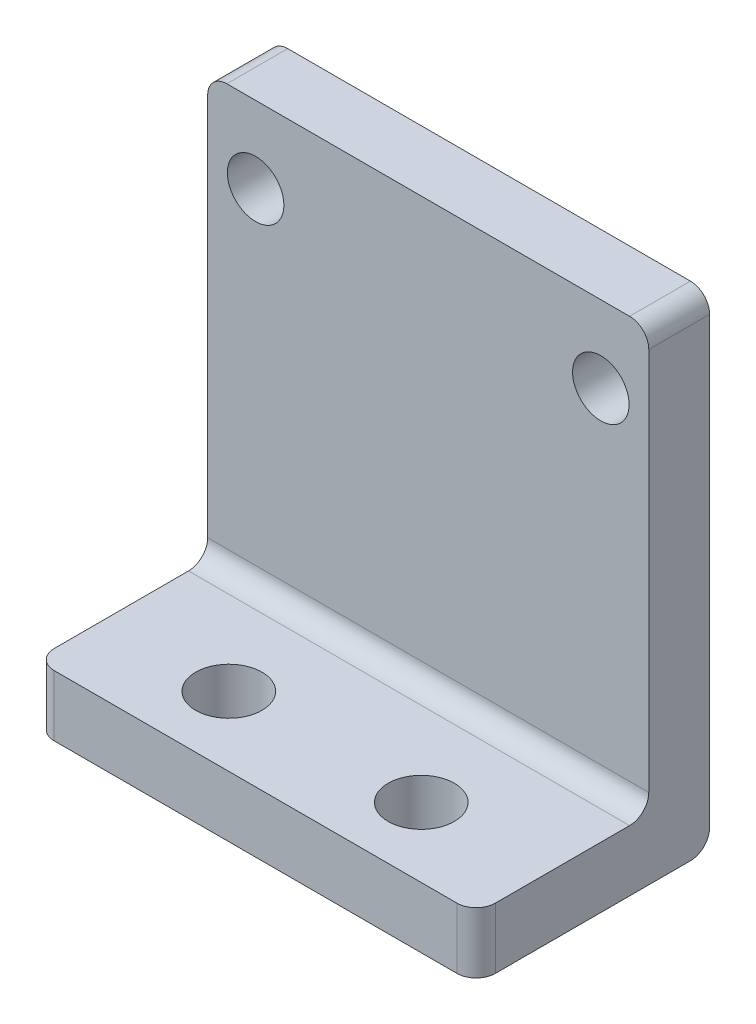
ISO-10303-21;
HEADER;
FILE_DESCRIPTION(('STEP AP214'),'2;1');
FILE_NAME('part.step','',(''),(''),'','','');
FILE_SCHEMA(('AUTOMOTIVE_DESIGN { 1 0 10303 214 1 1 1 1 }'));
ENDSEC;
DATA;
#1=APPLICATION_CONTEXT('core data for automotive mechanical design processes');
#2=APPLICATION_PROTOCOL_DEFINITION('international standard','automotive_design',2000,#1);
#3=PRODUCT_CONTEXT('',#1,'mechanical');
#4=PRODUCT('Part','Part','',(#3));
#5=PRODUCT_RELATED_PRODUCT_CATEGORY('part','',(#4));
#6=PRODUCT_DEFINITION_FORMATION('','',#4);
#7=PRODUCT_DEFINITION_CONTEXT('part definition',#1,'design');
#8=PRODUCT_DEFINITION('design','',#6,#7);
#9=PRODUCT_DEFINITION_SHAPE('','',#8);
#10=(LENGTH_UNIT() NAMED_UNIT(*) SI_UNIT(.MILLI.,.METRE.));
#11=(NAMED_UNIT(*) PLANE_ANGLE_UNIT() SI_UNIT($,.RADIAN.));
#12=(NAMED_UNIT(*) SI_UNIT($,.STERADIAN.) SOLID_ANGLE_UNIT());
#13=UNCERTAINTY_MEASURE_WITH_UNIT(LENGTH_MEASURE(1.E-05),#10,'distance_accuracy_value','');
#14=(GEOMETRIC_REPRESENTATION_CONTEXT(3) GLOBAL_UNCERTAINTY_ASSIGNED_CONTEXT((#13)) GLOBAL_UNIT_ASSIGNED_CONTEXT((#10,
#11,#12)) REPRESENTATION_CONTEXT('',''));
#15=CARTESIAN_POINT('',(0.,0.,0.));
#16=DIRECTION('',(0.,0.,1.));
#17=DIRECTION('',(1.,0.,0.));
#18=AXIS2_PLACEMENT_3D('',#15,#16,#17);
#19=CARTESIAN_POINT('',(23.,0.,3.175));
#20=DIRECTION('',(1.,0.,0.));
#21=DIRECTION('',(0.,1.,0.));
#22=AXIS2_PLACEMENT_3D('',#19,#20,#21);
#23=PLANE('',#22);
#24=DIRECTION('',(0.,-1.,0.));
#25=VECTOR('',#24,1.);
#26=CARTESIAN_POINT('',(23.,0.,0.));
#27=LINE('',#26,#25);
#28=CARTESIAN_POINT('',(23.,1.,0.));
#29=VERTEX_POINT('',#28);
#30=CARTESIAN_POINT('',(23.,-22.175,0.));
#31=VERTEX_POINT('',#30);
#32=EDGE_CURVE('E163',#29,#31,#27,.T.);
#33=ORIENTED_EDGE('',*,*,#32,.F.);
#34=DIRECTION('',(0.,0.,-1.));
#35=VECTOR('',#34,1.);
#36=CARTESIAN_POINT('',(23.,1.,3.175));
#37=LINE('',#36,#35);
#38=CARTESIAN_POINT('',(23.,1.,3.175));
#39=VERTEX_POINT('',#38);
#40=EDGE_CURVE('E189',#29,#39,#37,.F.);
#41=ORIENTED_EDGE('',*,*,#40,.T.);
#42=DIRECTION('',(0.,-1.,0.));
#43=VECTOR('',#42,1.);
#44=CARTESIAN_POINT('',(23.,0.,3.175));
#45=LINE('',#44,#43);
#46=CARTESIAN_POINT('',(23.,-19.,3.175));
#47=VERTEX_POINT('',#46);
#48=EDGE_CURVE('E262',#39,#47,#45,.T.);
#49=ORIENTED_EDGE('',*,*,#48,.T.);
#50=CARTESIAN_POINT('',(23.,-19.,4.175));
#51=DIRECTION('',(1.,0.,0.));
#52=DIRECTION('',(0.,1.,0.));
#53=AXIS2_PLACEMENT_3D('',#50,#51,#52);
#54=CIRCLE('',#53,1.);
#55=CARTESIAN_POINT('',(23.,-20.,4.175));
#56=VERTEX_POINT('',#55);
#57=EDGE_CURVE('E11',#47,#56,#54,.F.);
#58=ORIENTED_EDGE('',*,*,#57,.T.);
#59=DIRECTION('',(0.,0.,-1.));
#60=VECTOR('',#59,1.);
#61=CARTESIAN_POINT('',(23.,-20.,12.175));
#62=LINE('',#61,#60);
#63=CARTESIAN_POINT('',(23.,-20.,11.175));
#64=VERTEX_POINT('',#63);
#65=EDGE_CURVE('E260',#64,#56,#62,.T.);
#66=ORIENTED_EDGE('',*,*,#65,.F.);
#67=DIRECTION('',(0.,1.,0.));
#68=VECTOR('',#67,1.);
#69=CARTESIAN_POINT('',(23.,0.,11.175));
#70=LINE('',#69,#68);
#71=CARTESIAN_POINT('',(23.,-23.175,11.175));
#72=VERTEX_POINT('',#71);
#73=EDGE_CURVE('E186',#64,#72,#70,.F.);
#74=ORIENTED_EDGE('',*,*,#73,.T.);
#75=DIRECTION('',(0.,0.,-1.));
#76=VECTOR('',#75,1.);
#77=CARTESIAN_POINT('',(23.,-23.175,3.175));
#78=LINE('',#77,#76);
#79=CARTESIAN_POINT('',(23.,-23.175,1.));
#80=VERTEX_POINT('',#79);
#81=EDGE_CURVE('E175',#72,#80,#78,.T.);
#82=ORIENTED_EDGE('',*,*,#81,.T.);
#83=CARTESIAN_POINT('',(23.,-22.175,1.));
#84=DIRECTION('',(1.,0.,0.));
#85=DIRECTION('',(0.,1.,0.));
#86=AXIS2_PLACEMENT_3D('',#83,#84,#85);
#87=CIRCLE('',#86,1.);
#88=EDGE_CURVE('E183',#80,#31,#87,.T.);
#89=ORIENTED_EDGE('',*,*,#88,.T.);
#90=EDGE_LOOP('',(#33,#41,#49,#58,#66,#74,#82,#89));
#91=FACE_BOUND('',#90,.T.);
#92=ADVANCED_FACE('F49',(#91),#23,.T.);
#93=CARTESIAN_POINT('',(0.,2.,3.175));
#94=DIRECTION('',(0.,1.,0.));
#95=DIRECTION('',(0.,0.,1.));
#96=AXIS2_PLACEMENT_3D('',#93,#94,#95);
#97=PLANE('',#96);
#98=DIRECTION('',(1.,0.,0.));
#99=VECTOR('',#98,1.);
#100=CARTESIAN_POINT('',(0.,2.,3.175));
#101=LINE('',#100,#99);
#102=CARTESIAN_POINT('',(1.,2.,3.175));
#103=VERTEX_POINT('',#102);
#104=CARTESIAN_POINT('',(22.,2.,3.175));
#105=VERTEX_POINT('',#104);
#106=EDGE_CURVE('E252',#103,#105,#101,.T.);
#107=ORIENTED_EDGE('',*,*,#106,.T.);
#108=DIRECTION('',(0.,0.,-1.));
#109=VECTOR('',#108,1.);
#110=CARTESIAN_POINT('',(22.,2.,3.175));
#111=LINE('',#110,#109);
#112=CARTESIAN_POINT('',(22.,2.,0.));
#113=VERTEX_POINT('',#112);
#114=EDGE_CURVE('E161',#105,#113,#111,.T.);
#115=ORIENTED_EDGE('',*,*,#114,.T.);
#116=DIRECTION('',(1.,0.,0.));
#117=VECTOR('',#116,1.);
#118=CARTESIAN_POINT('',(0.,2.,0.));
#119=LINE('',#118,#117);
#120=CARTESIAN_POINT('',(1.,2.,0.));
#121=VERTEX_POINT('',#120);
#122=EDGE_CURVE('E143',#121,#113,#119,.T.);
#123=ORIENTED_EDGE('',*,*,#122,.F.);
#124=DIRECTION('',(0.,0.,-1.));
#125=VECTOR('',#124,1.);
#126=CARTESIAN_POINT('',(1.,2.,3.175));
#127=LINE('',#126,#125);
#128=EDGE_CURVE('E158',#121,#103,#127,.F.);
#129=ORIENTED_EDGE('',*,*,#128,.T.);
#130=EDGE_LOOP('',(#107,#115,#123,#129));
#131=FACE_BOUND('',#130,.T.);
#132=ADVANCED_FACE('F157',(#131),#97,.T.);
#133=CARTESIAN_POINT('',(0.,0.,3.175));
#134=DIRECTION('',(1.,0.,0.));
#135=DIRECTION('',(0.,1.,0.));
#136=AXIS2_PLACEMENT_3D('',#133,#134,#135);
#137=PLANE('',#136);
#138=DIRECTION('',(0.,-1.,0.));
#139=VECTOR('',#138,1.);
#140=CARTESIAN_POINT('',(0.,0.,3.175));
#141=LINE('',#140,#139);
#142=CARTESIAN_POINT('',(0.,1.,3.175));
#143=VERTEX_POINT('',#142);
#144=CARTESIAN_POINT('',(0.,-19.,3.175));
#145=VERTEX_POINT('',#144);
#146=EDGE_CURVE('E240',#143,#145,#141,.T.);
#147=ORIENTED_EDGE('',*,*,#146,.F.);
#148=DIRECTION('',(0.,0.,-1.));
#149=VECTOR('',#148,1.);
#150=CARTESIAN_POINT('',(0.,1.,0.));
#151=LINE('',#150,#149);
#152=CARTESIAN_POINT('',(0.,1.,0.));
#153=VERTEX_POINT('',#152);
#154=EDGE_CURVE('E207',#143,#153,#151,.T.);
#155=ORIENTED_EDGE('',*,*,#154,.T.);
#156=DIRECTION('',(0.,-1.,0.));
#157=VECTOR('',#156,1.);
#158=CARTESIAN_POINT('',(0.,0.,0.));
#159=LINE('',#158,#157);
#160=CARTESIAN_POINT('',(0.,-22.175,0.));
#161=VERTEX_POINT('',#160);
#162=EDGE_CURVE('E145',#153,#161,#159,.T.);
#163=ORIENTED_EDGE('',*,*,#162,.T.);
#164=CARTESIAN_POINT('',(0.,-22.175,1.));
#165=DIRECTION('',(1.,0.,0.));
#166=DIRECTION('',(0.,1.,0.));
#167=AXIS2_PLACEMENT_3D('',#164,#165,#166);
#168=CIRCLE('',#167,1.);
#169=CARTESIAN_POINT('',(0.,-23.175,1.));
#170=VERTEX_POINT('',#169);
#171=EDGE_CURVE('E200',#161,#170,#168,.F.);
#172=ORIENTED_EDGE('',*,*,#171,.T.);
#173=DIRECTION('',(0.,0.,-1.));
#174=VECTOR('',#173,1.);
#175=CARTESIAN_POINT('',(0.,-23.175,3.175));
#176=LINE('',#175,#174);
#177=CARTESIAN_POINT('',(0.,-23.175,11.175));
#178=VERTEX_POINT('',#177);
#179=EDGE_CURVE('E169',#178,#170,#176,.T.);
#180=ORIENTED_EDGE('',*,*,#179,.F.);
#181=DIRECTION('',(0.,1.,0.));
#182=VECTOR('',#181,1.);
#183=CARTESIAN_POINT('',(0.,-20.,11.175));
#184=LINE('',#183,#182);
#185=CARTESIAN_POINT('',(0.,-20.,11.175));
#186=VERTEX_POINT('',#185);
#187=EDGE_CURVE('E203',#178,#186,#184,.T.);
#188=ORIENTED_EDGE('',*,*,#187,.T.);
#189=DIRECTION('',(0.,0.,-1.));
#190=VECTOR('',#189,1.);
#191=CARTESIAN_POINT('',(0.,-20.,12.175));
#192=LINE('',#191,#190);
#193=CARTESIAN_POINT('',(0.,-20.,4.175));
#194=VERTEX_POINT('',#193);
#195=EDGE_CURVE('E242',#186,#194,#192,.T.);
#196=ORIENTED_EDGE('',*,*,#195,.T.);
#197=CARTESIAN_POINT('',(0.,-19.,4.175));
#198=DIRECTION('',(1.,0.,0.));
#199=DIRECTION('',(0.,1.,0.));
#200=AXIS2_PLACEMENT_3D('',#197,#198,#199);
#201=CIRCLE('',#200,1.);
#202=EDGE_CURVE('E58',#194,#145,#201,.T.);
#203=ORIENTED_EDGE('',*,*,#202,.T.);
#204=EDGE_LOOP('',(#147,#155,#163,#172,#180,#188,#196,#203));
#205=FACE_BOUND('',#204,.T.);
#206=ADVANCED_FACE('F239',(#205),#137,.F.);
#207=CARTESIAN_POINT('',(2.5,-2.,3.175));
#208=DIRECTION('',(0.,0.,-1.));
#209=DIRECTION('',(-1.,0.,0.));
#210=AXIS2_PLACEMENT_3D('',#207,#208,#209);
#211=CYLINDRICAL_SURFACE('',#210,1.4732);
#212=CARTESIAN_POINT('',(2.5,-2.,3.175));
#213=DIRECTION('',(0.,0.,1.));
#214=DIRECTION('',(1.,0.,0.));
#215=AXIS2_PLACEMENT_3D('',#212,#213,#214);
#216=CIRCLE('',#215,1.4732);
#217=CARTESIAN_POINT('',(3.9732,-2.,3.175));
#218=VERTEX_POINT('',#217);
#219=EDGE_CURVE('E283',#218,#218,#216,.T.);
#220=ORIENTED_EDGE('',*,*,#219,.T.);
#221=EDGE_LOOP('',(#220));
#222=FACE_BOUND('',#221,.T.);
#223=CARTESIAN_POINT('',(2.5,-2.,0.));
#224=DIRECTION('',(0.,0.,1.));
#225=DIRECTION('',(1.,0.,0.));
#226=AXIS2_PLACEMENT_3D('',#223,#224,#225);
#227=CIRCLE('',#226,1.4732);
#228=CARTESIAN_POINT('',(3.9732,-2.,0.));
#229=VERTEX_POINT('',#228);
#230=EDGE_CURVE('E272',#229,#229,#227,.T.);
#231=ORIENTED_EDGE('',*,*,#230,.F.);
#232=EDGE_LOOP('',(#231));
#233=FACE_BOUND('',#232,.T.);
#234=ADVANCED_FACE('F355',(#222,#233),#211,.F.);
#235=CARTESIAN_POINT('',(20.5,-2.,3.175));
#236=DIRECTION('',(0.,0.,-1.));
#237=DIRECTION('',(-1.,0.,0.));
#238=AXIS2_PLACEMENT_3D('',#235,#236,#237);
#239=CYLINDRICAL_SURFACE('',#238,1.4732);
#240=CARTESIAN_POINT('',(20.5,-2.,3.175));
#241=DIRECTION('',(0.,0.,1.));
#242=DIRECTION('',(1.,0.,0.));
#243=AXIS2_PLACEMENT_3D('',#240,#241,#242);
#244=CIRCLE('',#243,1.4732);
#245=CARTESIAN_POINT('',(21.9732,-2.,3.175));
#246=VERTEX_POINT('',#245);
#247=EDGE_CURVE('E279',#246,#246,#244,.T.);
#248=ORIENTED_EDGE('',*,*,#247,.T.);
#249=EDGE_LOOP('',(#248));
#250=FACE_BOUND('',#249,.T.);
#251=CARTESIAN_POINT('',(20.5,-2.,0.));
#252=DIRECTION('',(0.,0.,1.));
#253=DIRECTION('',(1.,0.,0.));
#254=AXIS2_PLACEMENT_3D('',#251,#252,#253);
#255=CIRCLE('',#254,1.4732);
#256=CARTESIAN_POINT('',(21.9732,-2.,0.));
#257=VERTEX_POINT('',#256);
#258=EDGE_CURVE('E267',#257,#257,#255,.T.);
#259=ORIENTED_EDGE('',*,*,#258,.F.);
#260=EDGE_LOOP('',(#259));
#261=FACE_BOUND('',#260,.T.);
#262=ADVANCED_FACE('F358',(#250,#261),#239,.F.);
#263=CARTESIAN_POINT('',(0.,-23.175,3.175));
#264=DIRECTION('',(0.,1.,0.));
#265=DIRECTION('',(0.,0.,1.));
#266=AXIS2_PLACEMENT_3D('',#263,#264,#265);
#267=PLANE('',#266);
#268=CARTESIAN_POINT('',(6.4835,-23.175,8.5555));
#269=DIRECTION('',(0.,1.,0.));
#270=DIRECTION('',(0.,0.,1.));
#271=AXIS2_PLACEMENT_3D('',#268,#269,#270);
#272=CIRCLE('',#271,1.7272);
#273=CARTESIAN_POINT('',(6.4835,-23.175,10.2827));
#274=VERTEX_POINT('',#273);
#275=EDGE_CURVE('E318',#274,#274,#272,.T.);
#276=ORIENTED_EDGE('',*,*,#275,.T.);
#277=EDGE_LOOP('',(#276));
#278=FACE_BOUND('',#277,.T.);
#279=CARTESIAN_POINT('',(16.5165,-23.175,8.5555));
#280=DIRECTION('',(0.,1.,0.));
#281=DIRECTION('',(0.,0.,1.));
#282=AXIS2_PLACEMENT_3D('',#279,#280,#281);
#283=CIRCLE('',#282,1.7272);
#284=CARTESIAN_POINT('',(16.5165,-23.175,10.2827));
#285=VERTEX_POINT('',#284);
#286=EDGE_CURVE('E308',#285,#285,#283,.T.);
#287=ORIENTED_EDGE('',*,*,#286,.T.);
#288=EDGE_LOOP('',(#287));
#289=FACE_BOUND('',#288,.T.);
#290=DIRECTION('',(-1.,0.,0.));
#291=VECTOR('',#290,1.);
#292=CARTESIAN_POINT('',(0.,-23.175,12.175));
#293=LINE('',#292,#291);
#294=CARTESIAN_POINT('',(22.,-23.175,12.175));
#295=VERTEX_POINT('',#294);
#296=CARTESIAN_POINT('',(1.,-23.175,12.175));
#297=VERTEX_POINT('',#296);
#298=EDGE_CURVE('E274',#295,#297,#293,.T.);
#299=ORIENTED_EDGE('',*,*,#298,.T.);
#300=CARTESIAN_POINT('',(1.,-23.175,11.175));
#301=DIRECTION('',(0.,1.,0.));
#302=DIRECTION('',(0.,0.,1.));
#303=AXIS2_PLACEMENT_3D('',#300,#301,#302);
#304=CIRCLE('',#303,1.);
#305=EDGE_CURVE('E232',#297,#178,#304,.F.);
#306=ORIENTED_EDGE('',*,*,#305,.T.);
#307=ORIENTED_EDGE('',*,*,#179,.T.);
#308=DIRECTION('',(1.,0.,0.));
#309=VECTOR('',#308,1.);
#310=CARTESIAN_POINT('',(0.,-23.175,1.));
#311=LINE('',#310,#309);
#312=EDGE_CURVE('E226',#170,#80,#311,.T.);
#313=ORIENTED_EDGE('',*,*,#312,.T.);
#314=ORIENTED_EDGE('',*,*,#81,.F.);
#315=CARTESIAN_POINT('',(22.,-23.175,11.175));
#316=DIRECTION('',(0.,1.,0.));
#317=DIRECTION('',(0.,0.,1.));
#318=AXIS2_PLACEMENT_3D('',#315,#316,#317);
#319=CIRCLE('',#318,1.);
#320=EDGE_CURVE('E72',#72,#295,#319,.F.);
#321=ORIENTED_EDGE('',*,*,#320,.T.);
#322=EDGE_LOOP('',(#299,#306,#307,#313,#314,#321));
#323=FACE_BOUND('',#322,.T.);
#324=ADVANCED_FACE('F300',(#278,#289,#323),#267,.F.);
#325=CARTESIAN_POINT('',(0.,0.,3.175));
#326=DIRECTION('',(0.,0.,1.));
#327=DIRECTION('',(1.,0.,0.));
#328=AXIS2_PLACEMENT_3D('',#325,#326,#327);
#329=PLANE('',#328);
#330=ORIENTED_EDGE('',*,*,#48,.F.);
#331=CARTESIAN_POINT('',(22.,1.,3.175));
#332=DIRECTION('',(0.,0.,1.));
#333=DIRECTION('',(1.,0.,0.));
#334=AXIS2_PLACEMENT_3D('',#331,#332,#333);
#335=CIRCLE('',#334,1.);
#336=EDGE_CURVE('E197',#39,#105,#335,.T.);
#337=ORIENTED_EDGE('',*,*,#336,.T.);
#338=ORIENTED_EDGE('',*,*,#106,.F.);
#339=CARTESIAN_POINT('',(1.,1.,3.175));
#340=DIRECTION('',(0.,0.,1.));
#341=DIRECTION('',(1.,0.,0.));
#342=AXIS2_PLACEMENT_3D('',#339,#340,#341);
#343=CIRCLE('',#342,1.);
#344=EDGE_CURVE('E167',#103,#143,#343,.T.);
#345=ORIENTED_EDGE('',*,*,#344,.T.);
#346=ORIENTED_EDGE('',*,*,#146,.T.);
#347=DIRECTION('',(-1.,0.,0.));
#348=VECTOR('',#347,1.);
#349=CARTESIAN_POINT('',(0.,-19.,3.175));
#350=LINE('',#349,#348);
#351=EDGE_CURVE('E192',#145,#47,#350,.F.);
#352=ORIENTED_EDGE('',*,*,#351,.T.);
#353=EDGE_LOOP('',(#330,#337,#338,#345,#346,#352));
#354=FACE_BOUND('',#353,.T.);
#355=ORIENTED_EDGE('',*,*,#247,.F.);
#356=EDGE_LOOP('',(#355));
#357=FACE_BOUND('',#356,.T.);
#358=ORIENTED_EDGE('',*,*,#219,.F.);
#359=EDGE_LOOP('',(#358));
#360=FACE_BOUND('',#359,.T.);
#361=ADVANCED_FACE('F248',(#354,#357,#360),#329,.T.);
#362=CARTESIAN_POINT('',(0.,0.,0.));
#363=DIRECTION('',(0.,0.,1.));
#364=DIRECTION('',(1.,0.,0.));
#365=AXIS2_PLACEMENT_3D('',#362,#363,#364);
#366=PLANE('',#365);
#367=ORIENTED_EDGE('',*,*,#258,.T.);
#368=EDGE_LOOP('',(#367));
#369=FACE_BOUND('',#368,.T.);
#370=ORIENTED_EDGE('',*,*,#230,.T.);
#371=EDGE_LOOP('',(#370));
#372=FACE_BOUND('',#371,.T.);
#373=ORIENTED_EDGE('',*,*,#122,.T.);
#374=CARTESIAN_POINT('',(22.,1.,0.));
#375=DIRECTION('',(0.,0.,1.));
#376=DIRECTION('',(1.,0.,0.));
#377=AXIS2_PLACEMENT_3D('',#374,#375,#376);
#378=CIRCLE('',#377,1.);
#379=EDGE_CURVE('E151',#113,#29,#378,.F.);
#380=ORIENTED_EDGE('',*,*,#379,.T.);
#381=ORIENTED_EDGE('',*,*,#32,.T.);
#382=DIRECTION('',(1.,0.,0.));
#383=VECTOR('',#382,1.);
#384=CARTESIAN_POINT('',(0.,-22.175,0.));
#385=LINE('',#384,#383);
#386=EDGE_CURVE('E152',#31,#161,#385,.F.);
#387=ORIENTED_EDGE('',*,*,#386,.T.);
#388=ORIENTED_EDGE('',*,*,#162,.F.);
#389=CARTESIAN_POINT('',(1.,1.,0.));
#390=DIRECTION('',(0.,0.,1.));
#391=DIRECTION('',(1.,0.,0.));
#392=AXIS2_PLACEMENT_3D('',#389,#390,#391);
#393=CIRCLE('',#392,1.);
#394=EDGE_CURVE('E140',#153,#121,#393,.F.);
#395=ORIENTED_EDGE('',*,*,#394,.T.);
#396=EDGE_LOOP('',(#373,#380,#381,#387,#388,#395));
#397=FACE_BOUND('',#396,.T.);
#398=ADVANCED_FACE('F142',(#369,#372,#397),#366,.F.);
#399=CARTESIAN_POINT('',(0.,-20.,12.175));
#400=DIRECTION('',(0.,-1.,0.));
#401=DIRECTION('',(1.,0.,0.));
#402=AXIS2_PLACEMENT_3D('',#399,#400,#401);
#403=PLANE('',#402);
#404=CARTESIAN_POINT('',(6.4835,-20.,8.5555));
#405=DIRECTION('',(0.,1.,0.));
#406=DIRECTION('',(0.,0.,1.));
#407=AXIS2_PLACEMENT_3D('',#404,#405,#406);
#408=CIRCLE('',#407,1.7272);
#409=CARTESIAN_POINT('',(6.4835,-20.,10.2827));
#410=VERTEX_POINT('',#409);
#411=EDGE_CURVE('E322',#410,#410,#408,.T.);
#412=ORIENTED_EDGE('',*,*,#411,.F.);
#413=EDGE_LOOP('',(#412));
#414=FACE_BOUND('',#413,.T.);
#415=CARTESIAN_POINT('',(16.5165,-20.,8.5555));
#416=DIRECTION('',(0.,1.,0.));
#417=DIRECTION('',(0.,0.,1.));
#418=AXIS2_PLACEMENT_3D('',#415,#416,#417);
#419=CIRCLE('',#418,1.7272);
#420=CARTESIAN_POINT('',(16.5165,-20.,10.2827));
#421=VERTEX_POINT('',#420);
#422=EDGE_CURVE('E312',#421,#421,#419,.T.);
#423=ORIENTED_EDGE('',*,*,#422,.F.);
#424=EDGE_LOOP('',(#423));
#425=FACE_BOUND('',#424,.T.);
#426=ORIENTED_EDGE('',*,*,#65,.T.);
#427=DIRECTION('',(-1.,0.,0.));
#428=VECTOR('',#427,1.);
#429=CARTESIAN_POINT('',(0.,-20.,4.175));
#430=LINE('',#429,#428);
#431=EDGE_CURVE('E216',#56,#194,#430,.T.);
#432=ORIENTED_EDGE('',*,*,#431,.T.);
#433=ORIENTED_EDGE('',*,*,#195,.F.);
#434=CARTESIAN_POINT('',(1.,-20.,11.175));
#435=DIRECTION('',(0.,-1.,0.));
#436=DIRECTION('',(1.,0.,0.));
#437=AXIS2_PLACEMENT_3D('',#434,#435,#436);
#438=CIRCLE('',#437,1.);
#439=CARTESIAN_POINT('',(1.,-20.,12.175));
#440=VERTEX_POINT('',#439);
#441=EDGE_CURVE('E213',#186,#440,#438,.F.);
#442=ORIENTED_EDGE('',*,*,#441,.T.);
#443=DIRECTION('',(-1.,0.,0.));
#444=VECTOR('',#443,1.);
#445=CARTESIAN_POINT('',(0.,-20.,12.175));
#446=LINE('',#445,#444);
#447=CARTESIAN_POINT('',(22.,-20.,12.175));
#448=VERTEX_POINT('',#447);
#449=EDGE_CURVE('E306',#448,#440,#446,.T.);
#450=ORIENTED_EDGE('',*,*,#449,.F.);
#451=CARTESIAN_POINT('',(22.,-20.,11.175));
#452=DIRECTION('',(0.,-1.,0.));
#453=DIRECTION('',(1.,0.,0.));
#454=AXIS2_PLACEMENT_3D('',#451,#452,#453);
#455=CIRCLE('',#454,1.);
#456=EDGE_CURVE('E210',#448,#64,#455,.F.);
#457=ORIENTED_EDGE('',*,*,#456,.T.);
#458=EDGE_LOOP('',(#426,#432,#433,#442,#450,#457));
#459=FACE_BOUND('',#458,.T.);
#460=ADVANCED_FACE('F264',(#414,#425,#459),#403,.F.);
#461=CARTESIAN_POINT('',(0.,0.,12.175));
#462=DIRECTION('',(0.,0.,1.));
#463=DIRECTION('',(1.,0.,0.));
#464=AXIS2_PLACEMENT_3D('',#461,#462,#463);
#465=PLANE('',#464);
#466=ORIENTED_EDGE('',*,*,#449,.T.);
#467=DIRECTION('',(0.,1.,0.));
#468=VECTOR('',#467,1.);
#469=CARTESIAN_POINT('',(1.,-23.175,12.175));
#470=LINE('',#469,#468);
#471=EDGE_CURVE('E65',#440,#297,#470,.F.);
#472=ORIENTED_EDGE('',*,*,#471,.T.);
#473=ORIENTED_EDGE('',*,*,#298,.F.);
#474=DIRECTION('',(0.,1.,0.));
#475=VECTOR('',#474,1.);
#476=CARTESIAN_POINT('',(22.,0.,12.175));
#477=LINE('',#476,#475);
#478=EDGE_CURVE('E220',#295,#448,#477,.T.);
#479=ORIENTED_EDGE('',*,*,#478,.T.);
#480=EDGE_LOOP('',(#466,#472,#473,#479));
#481=FACE_BOUND('',#480,.T.);
#482=ADVANCED_FACE('F305',(#481),#465,.T.);
#483=CARTESIAN_POINT('',(16.5165,-20.,8.5555));
#484=DIRECTION('',(0.,1.,0.));
#485=DIRECTION('',(0.,0.,1.));
#486=AXIS2_PLACEMENT_3D('',#483,#484,#485);
#487=CYLINDRICAL_SURFACE('',#486,1.7272);
#488=ORIENTED_EDGE('',*,*,#286,.F.);
#489=EDGE_LOOP('',(#488));
#490=FACE_BOUND('',#489,.T.);
#491=ORIENTED_EDGE('',*,*,#422,.T.);
#492=EDGE_LOOP('',(#491));
#493=FACE_BOUND('',#492,.T.);
#494=ADVANCED_FACE('F334',(#490,#493),#487,.F.);
#495=CARTESIAN_POINT('',(6.4835,-20.,8.5555));
#496=DIRECTION('',(0.,1.,0.));
#497=DIRECTION('',(0.,0.,1.));
#498=AXIS2_PLACEMENT_3D('',#495,#496,#497);
#499=CYLINDRICAL_SURFACE('',#498,1.7272);
#500=ORIENTED_EDGE('',*,*,#275,.F.);
#501=EDGE_LOOP('',(#500));
#502=FACE_BOUND('',#501,.T.);
#503=ORIENTED_EDGE('',*,*,#411,.T.);
#504=EDGE_LOOP('',(#503));
#505=FACE_BOUND('',#504,.T.);
#506=ADVANCED_FACE('F327',(#502,#505),#499,.F.);
#507=CARTESIAN_POINT('',(22.,1.,3.175));
#508=DIRECTION('',(0.,0.,-1.));
#509=DIRECTION('',(-1.,0.,0.));
#510=AXIS2_PLACEMENT_3D('',#507,#508,#509);
#511=CYLINDRICAL_SURFACE('',#510,1.);
#512=ORIENTED_EDGE('',*,*,#336,.F.);
#513=ORIENTED_EDGE('',*,*,#40,.F.);
#514=ORIENTED_EDGE('',*,*,#379,.F.);
#515=ORIENTED_EDGE('',*,*,#114,.F.);
#516=EDGE_LOOP('',(#512,#513,#514,#515));
#517=FACE_BOUND('',#516,.T.);
#518=ADVANCED_FACE('F342',(#517),#511,.T.);
#519=CARTESIAN_POINT('',(1.,1.,3.175));
#520=DIRECTION('',(0.,0.,1.));
#521=DIRECTION('',(1.,0.,0.));
#522=AXIS2_PLACEMENT_3D('',#519,#520,#521);
#523=CYLINDRICAL_SURFACE('',#522,1.);
#524=ORIENTED_EDGE('',*,*,#344,.F.);
#525=ORIENTED_EDGE('',*,*,#128,.F.);
#526=ORIENTED_EDGE('',*,*,#394,.F.);
#527=ORIENTED_EDGE('',*,*,#154,.F.);
#528=EDGE_LOOP('',(#524,#525,#526,#527));
#529=FACE_BOUND('',#528,.T.);
#530=ADVANCED_FACE('F166',(#529),#523,.T.);
#531=CARTESIAN_POINT('',(0.,-19.,4.175));
#532=DIRECTION('',(-1.,0.,0.));
#533=DIRECTION('',(0.,-1.,0.));
#534=AXIS2_PLACEMENT_3D('',#531,#532,#533);
#535=CYLINDRICAL_SURFACE('',#534,1.);
#536=ORIENTED_EDGE('',*,*,#57,.F.);
#537=ORIENTED_EDGE('',*,*,#351,.F.);
#538=ORIENTED_EDGE('',*,*,#202,.F.);
#539=ORIENTED_EDGE('',*,*,#431,.F.);
#540=EDGE_LOOP('',(#536,#537,#538,#539));
#541=FACE_BOUND('',#540,.T.);
#542=ADVANCED_FACE('F255',(#541),#535,.F.);
#543=CARTESIAN_POINT('',(1.,0.,11.175));
#544=DIRECTION('',(0.,-1.,0.));
#545=DIRECTION('',(1.,0.,0.));
#546=AXIS2_PLACEMENT_3D('',#543,#544,#545);
#547=CYLINDRICAL_SURFACE('',#546,1.);
#548=ORIENTED_EDGE('',*,*,#305,.F.);
#549=ORIENTED_EDGE('',*,*,#471,.F.);
#550=ORIENTED_EDGE('',*,*,#441,.F.);
#551=ORIENTED_EDGE('',*,*,#187,.F.);
#552=EDGE_LOOP('',(#548,#549,#550,#551));
#553=FACE_BOUND('',#552,.T.);
#554=ADVANCED_FACE('F370',(#553),#547,.T.);
#555=CARTESIAN_POINT('',(22.,0.,11.175));
#556=DIRECTION('',(0.,1.,0.));
#557=DIRECTION('',(-1.,0.,0.));
#558=AXIS2_PLACEMENT_3D('',#555,#556,#557);
#559=CYLINDRICAL_SURFACE('',#558,1.);
#560=ORIENTED_EDGE('',*,*,#320,.F.);
#561=ORIENTED_EDGE('',*,*,#73,.F.);
#562=ORIENTED_EDGE('',*,*,#456,.F.);
#563=ORIENTED_EDGE('',*,*,#478,.F.);
#564=EDGE_LOOP('',(#560,#561,#562,#563));
#565=FACE_BOUND('',#564,.T.);
#566=ADVANCED_FACE('F304',(#565),#559,.T.);
#567=CARTESIAN_POINT('',(0.,-22.175,1.));
#568=DIRECTION('',(1.,0.,0.));
#569=DIRECTION('',(0.,0.,-1.));
#570=AXIS2_PLACEMENT_3D('',#567,#568,#569);
#571=CYLINDRICAL_SURFACE('',#570,1.);
#572=ORIENTED_EDGE('',*,*,#171,.F.);
#573=ORIENTED_EDGE('',*,*,#386,.F.);
#574=ORIENTED_EDGE('',*,*,#88,.F.);
#575=ORIENTED_EDGE('',*,*,#312,.F.);
#576=EDGE_LOOP('',(#572,#573,#574,#575));
#577=FACE_BOUND('',#576,.T.);
#578=ADVANCED_FACE('F51',(#577),#571,.T.);
#579=CLOSED_SHELL('',(#92,#132,#206,#234,#262,#324,#361,#398,#460,#482,#494,#506,#518,#530,#542,
#554,#566,#578));
#580=MANIFOLD_SOLID_BREP('B2',#579);
#581=ADVANCED_BREP_SHAPE_REPRESENTATION('',(#18,#580),#14);
#582=SHAPE_DEFINITION_REPRESENTATION(#9,#581);
ENDSEC;
END-ISO-10303-21;
